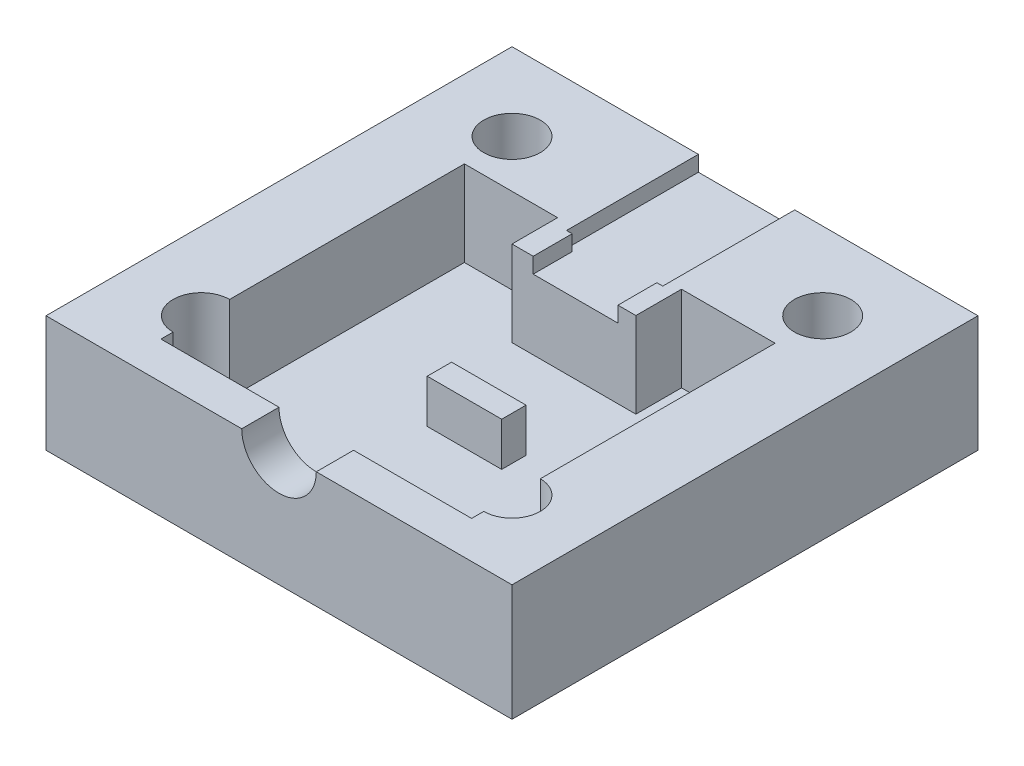
ISO-10303-21;
HEADER;
FILE_DESCRIPTION(('STEP AP214'),'2;1');
FILE_NAME('part.step','',(''),(''),'','','');
FILE_SCHEMA(('AUTOMOTIVE_DESIGN { 1 0 10303 214 1 1 1 1 }'));
ENDSEC;
DATA;
#1=APPLICATION_CONTEXT('core data for automotive mechanical design processes');
#2=APPLICATION_PROTOCOL_DEFINITION('international standard','automotive_design',2000,#1);
#3=PRODUCT_CONTEXT('',#1,'mechanical');
#4=PRODUCT('Part','Part','',(#3));
#5=PRODUCT_RELATED_PRODUCT_CATEGORY('part','',(#4));
#6=PRODUCT_DEFINITION_FORMATION('','',#4);
#7=PRODUCT_DEFINITION_CONTEXT('part definition',#1,'design');
#8=PRODUCT_DEFINITION('design','',#6,#7);
#9=PRODUCT_DEFINITION_SHAPE('','',#8);
#10=(LENGTH_UNIT() NAMED_UNIT(*) SI_UNIT(.MILLI.,.METRE.));
#11=(NAMED_UNIT(*) PLANE_ANGLE_UNIT() SI_UNIT($,.RADIAN.));
#12=(NAMED_UNIT(*) SI_UNIT($,.STERADIAN.) SOLID_ANGLE_UNIT());
#13=UNCERTAINTY_MEASURE_WITH_UNIT(LENGTH_MEASURE(1.E-05),#10,'distance_accuracy_value','');
#14=(GEOMETRIC_REPRESENTATION_CONTEXT(3) GLOBAL_UNCERTAINTY_ASSIGNED_CONTEXT((#13)) GLOBAL_UNIT_ASSIGNED_CONTEXT((#10,
#11,#12)) REPRESENTATION_CONTEXT('',''));
#15=CARTESIAN_POINT('',(0.,0.,0.));
#16=DIRECTION('',(0.,0.,1.));
#17=DIRECTION('',(1.,0.,0.));
#18=AXIS2_PLACEMENT_3D('',#15,#16,#17);
#19=CARTESIAN_POINT('',(0.,2.54,0.));
#20=DIRECTION('',(0.,1.,0.));
#21=DIRECTION('',(0.,0.,1.));
#22=AXIS2_PLACEMENT_3D('',#19,#20,#21);
#23=PLANE('',#22);
#24=CARTESIAN_POINT('',(44.45,2.54,-6.35));
#25=DIRECTION('',(0.,1.,0.));
#26=DIRECTION('',(0.,0.,1.));
#27=AXIS2_PLACEMENT_3D('',#24,#25,#26);
#28=CIRCLE('',#27,2.3114);
#29=CARTESIAN_POINT('',(44.45,2.54,-8.6614));
#30=VERTEX_POINT('',#29);
#31=CARTESIAN_POINT('',(44.45,2.54,-4.0386));
#32=VERTEX_POINT('',#31);
#33=EDGE_CURVE('E46',#30,#32,#28,.T.);
#34=ORIENTED_EDGE('',*,*,#33,.F.);
#35=DIRECTION('',(0.,0.,-1.));
#36=VECTOR('',#35,1.);
#37=CARTESIAN_POINT('',(44.45,2.54,-24.13));
#38=LINE('',#37,#36);
#39=CARTESIAN_POINT('',(44.45,2.54,-27.8594268283473));
#40=VERTEX_POINT('',#39);
#41=EDGE_CURVE('E400',#30,#40,#38,.T.);
#42=ORIENTED_EDGE('',*,*,#41,.T.);
#43=DIRECTION('',(-1.,0.,0.));
#44=VECTOR('',#43,1.);
#45=CARTESIAN_POINT('',(44.45,2.54,-27.8594268283473));
#46=LINE('',#45,#44);
#47=CARTESIAN_POINT('',(36.7988438248262,2.54,-27.8594268283473));
#48=VERTEX_POINT('',#47);
#49=EDGE_CURVE('E291',#40,#48,#46,.T.);
#50=ORIENTED_EDGE('',*,*,#49,.T.);
#51=DIRECTION('',(0.,0.,1.));
#52=VECTOR('',#51,1.);
#53=CARTESIAN_POINT('',(36.7988438248262,2.54,-24.13));
#54=LINE('',#53,#52);
#55=CARTESIAN_POINT('',(36.7988438248262,2.54,-24.13));
#56=VERTEX_POINT('',#55);
#57=EDGE_CURVE('E61',#48,#56,#54,.T.);
#58=ORIENTED_EDGE('',*,*,#57,.T.);
#59=DIRECTION('',(-1.,0.,0.));
#60=VECTOR('',#59,1.);
#61=CARTESIAN_POINT('',(19.05,2.54,-24.13));
#62=LINE('',#61,#60);
#63=CARTESIAN_POINT('',(26.67,2.54,-24.13));
#64=VERTEX_POINT('',#63);
#65=EDGE_CURVE('E404',#56,#64,#62,.T.);
#66=ORIENTED_EDGE('',*,*,#65,.T.);
#67=DIRECTION('',(0.,0.,-1.));
#68=VECTOR('',#67,1.);
#69=CARTESIAN_POINT('',(26.67,2.54,-24.13));
#70=LINE('',#69,#68);
#71=CARTESIAN_POINT('',(26.67,2.54,-27.8594268283473));
#72=VERTEX_POINT('',#71);
#73=EDGE_CURVE('E270',#64,#72,#70,.T.);
#74=ORIENTED_EDGE('',*,*,#73,.T.);
#75=DIRECTION('',(-1.,0.,0.));
#76=VECTOR('',#75,1.);
#77=CARTESIAN_POINT('',(26.67,2.54,-27.8594268283473));
#78=LINE('',#77,#76);
#79=CARTESIAN_POINT('',(19.05,2.54,-27.8594268283473));
#80=VERTEX_POINT('',#79);
#81=EDGE_CURVE('E273',#72,#80,#78,.T.);
#82=ORIENTED_EDGE('',*,*,#81,.T.);
#83=DIRECTION('',(0.,0.,1.));
#84=VECTOR('',#83,1.);
#85=CARTESIAN_POINT('',(19.05,2.54,-24.13));
#86=LINE('',#85,#84);
#87=CARTESIAN_POINT('',(19.05,2.54,-8.6614));
#88=VERTEX_POINT('',#87);
#89=EDGE_CURVE('E393',#80,#88,#86,.T.);
#90=ORIENTED_EDGE('',*,*,#89,.T.);
#91=CARTESIAN_POINT('',(19.05,2.54,-6.35));
#92=DIRECTION('',(0.,1.,0.));
#93=DIRECTION('',(0.,0.,1.));
#94=AXIS2_PLACEMENT_3D('',#91,#92,#93);
#95=CIRCLE('',#94,2.3114);
#96=CARTESIAN_POINT('',(19.05,2.54,-4.0386));
#97=VERTEX_POINT('',#96);
#98=EDGE_CURVE('E461',#97,#88,#95,.T.);
#99=ORIENTED_EDGE('',*,*,#98,.F.);
#100=CARTESIAN_POINT('',(19.05,2.54,-3.048));
#101=VERTEX_POINT('',#100);
#102=EDGE_CURVE('E397',#97,#101,#86,.T.);
#103=ORIENTED_EDGE('',*,*,#102,.T.);
#104=DIRECTION('',(1.,0.,0.));
#105=VECTOR('',#104,1.);
#106=CARTESIAN_POINT('',(19.05,2.54,-3.048));
#107=LINE('',#106,#105);
#108=CARTESIAN_POINT('',(44.45,2.54,-3.048));
#109=VERTEX_POINT('',#108);
#110=EDGE_CURVE('E396',#101,#109,#107,.T.);
#111=ORIENTED_EDGE('',*,*,#110,.T.);
#112=EDGE_CURVE('E401',#109,#32,#38,.T.);
#113=ORIENTED_EDGE('',*,*,#112,.T.);
#114=EDGE_LOOP('',(#34,#42,#50,#58,#66,#74,#82,#90,#99,#103,#111,#113));
#115=FACE_BOUND('',#114,.T.);
#116=DIRECTION('',(1.,0.,0.));
#117=VECTOR('',#116,1.);
#118=CARTESIAN_POINT('',(29.1366001502802,2.54,-14.732));
#119=LINE('',#118,#117);
#120=CARTESIAN_POINT('',(29.1366001502802,2.54,-14.732));
#121=VERTEX_POINT('',#120);
#122=CARTESIAN_POINT('',(35.2249602397373,2.54,-14.732));
#123=VERTEX_POINT('',#122);
#124=EDGE_CURVE('E877',#121,#123,#119,.T.);
#125=ORIENTED_EDGE('',*,*,#124,.F.);
#126=DIRECTION('',(0.,0.,1.));
#127=VECTOR('',#126,1.);
#128=CARTESIAN_POINT('',(29.1366001502802,2.54,-16.7237869469527));
#129=LINE('',#128,#127);
#130=CARTESIAN_POINT('',(29.1366001502802,2.54,-16.7237869469527));
#131=VERTEX_POINT('',#130);
#132=EDGE_CURVE('E260',#131,#121,#129,.T.);
#133=ORIENTED_EDGE('',*,*,#132,.F.);
#134=DIRECTION('',(-1.,0.,0.));
#135=VECTOR('',#134,1.);
#136=CARTESIAN_POINT('',(29.1366001502802,2.54,-16.7237869469527));
#137=LINE('',#136,#135);
#138=CARTESIAN_POINT('',(35.2249602397373,2.54,-16.7237869469527));
#139=VERTEX_POINT('',#138);
#140=EDGE_CURVE('E256',#139,#131,#137,.T.);
#141=ORIENTED_EDGE('',*,*,#140,.F.);
#142=DIRECTION('',(0.,0.,-1.));
#143=VECTOR('',#142,1.);
#144=CARTESIAN_POINT('',(35.2249602397373,2.54,-16.7237869469527));
#145=LINE('',#144,#143);
#146=EDGE_CURVE('E874',#123,#139,#145,.T.);
#147=ORIENTED_EDGE('',*,*,#146,.F.);
#148=EDGE_LOOP('',(#125,#133,#141,#147));
#149=FACE_BOUND('',#148,.T.);
#150=ADVANCED_FACE('F38',(#115,#149),#23,.T.);
#151=CARTESIAN_POINT('',(0.,9.525,0.));
#152=DIRECTION('',(0.,-1.,0.));
#153=DIRECTION('',(0.,0.,-1.));
#154=AXIS2_PLACEMENT_3D('',#151,#152,#153);
#155=PLANE('',#154);
#156=CARTESIAN_POINT('',(44.45,9.525,-31.75));
#157=DIRECTION('',(0.,1.,0.));
#158=DIRECTION('',(0.,0.,1.));
#159=AXIS2_PLACEMENT_3D('',#156,#157,#158);
#160=CIRCLE('',#159,2.3114);
#161=CARTESIAN_POINT('',(44.45,9.525,-29.4386));
#162=VERTEX_POINT('',#161);
#163=EDGE_CURVE('E368',#162,#162,#160,.T.);
#164=ORIENTED_EDGE('',*,*,#163,.F.);
#165=EDGE_LOOP('',(#164));
#166=FACE_BOUND('',#165,.T.);
#167=DIRECTION('',(-1.,0.,0.));
#168=VECTOR('',#167,1.);
#169=CARTESIAN_POINT('',(44.45,9.525,-27.8594268283473));
#170=LINE('',#169,#168);
#171=CARTESIAN_POINT('',(44.45,9.525,-27.8594268283473));
#172=VERTEX_POINT('',#171);
#173=CARTESIAN_POINT('',(36.7988438248262,9.525,-27.8594268283473));
#174=VERTEX_POINT('',#173);
#175=EDGE_CURVE('E262',#172,#174,#170,.T.);
#176=ORIENTED_EDGE('',*,*,#175,.F.);
#177=DIRECTION('',(0.,0.,-1.));
#178=VECTOR('',#177,1.);
#179=CARTESIAN_POINT('',(44.45,9.525,-24.13));
#180=LINE('',#179,#178);
#181=CARTESIAN_POINT('',(44.45,9.525,-8.6614));
#182=VERTEX_POINT('',#181);
#183=EDGE_CURVE('E415',#182,#172,#180,.T.);
#184=ORIENTED_EDGE('',*,*,#183,.F.);
#185=CARTESIAN_POINT('',(44.45,9.525,-6.35));
#186=DIRECTION('',(0.,1.,0.));
#187=DIRECTION('',(0.,0.,1.));
#188=AXIS2_PLACEMENT_3D('',#185,#186,#187);
#189=CIRCLE('',#188,2.3114);
#190=CARTESIAN_POINT('',(44.45,9.525,-4.0386));
#191=VERTEX_POINT('',#190);
#192=EDGE_CURVE('E356',#191,#182,#189,.T.);
#193=ORIENTED_EDGE('',*,*,#192,.F.);
#194=CARTESIAN_POINT('',(44.45,9.525,-3.048));
#195=VERTEX_POINT('',#194);
#196=EDGE_CURVE('E416',#195,#191,#180,.T.);
#197=ORIENTED_EDGE('',*,*,#196,.F.);
#198=DIRECTION('',(1.,0.,0.));
#199=VECTOR('',#198,1.);
#200=CARTESIAN_POINT('',(19.05,9.525,-3.048));
#201=LINE('',#200,#199);
#202=CARTESIAN_POINT('',(34.798,9.525,-3.048));
#203=VERTEX_POINT('',#202);
#204=EDGE_CURVE('E410',#203,#195,#201,.T.);
#205=ORIENTED_EDGE('',*,*,#204,.F.);
#206=DIRECTION('',(0.,0.,1.));
#207=VECTOR('',#206,1.);
#208=CARTESIAN_POINT('',(34.798,9.525,-14.986));
#209=LINE('',#208,#207);
#210=CARTESIAN_POINT('',(34.798,9.525,0.));
#211=VERTEX_POINT('',#210);
#212=EDGE_CURVE('E306',#203,#211,#209,.T.);
#213=ORIENTED_EDGE('',*,*,#212,.T.);
#214=DIRECTION('',(1.,0.,0.));
#215=VECTOR('',#214,1.);
#216=CARTESIAN_POINT('',(12.7,9.525,0.));
#217=LINE('',#216,#215);
#218=CARTESIAN_POINT('',(50.8,9.525,0.));
#219=VERTEX_POINT('',#218);
#220=EDGE_CURVE('E431',#211,#219,#217,.T.);
#221=ORIENTED_EDGE('',*,*,#220,.T.);
#222=DIRECTION('',(0.,0.,-1.));
#223=VECTOR('',#222,1.);
#224=CARTESIAN_POINT('',(50.8,9.525,0.));
#225=LINE('',#224,#223);
#226=CARTESIAN_POINT('',(50.8,9.525,-38.1));
#227=VERTEX_POINT('',#226);
#228=EDGE_CURVE('E436',#219,#227,#225,.T.);
#229=ORIENTED_EDGE('',*,*,#228,.T.);
#230=DIRECTION('',(-1.,0.,0.));
#231=VECTOR('',#230,1.);
#232=CARTESIAN_POINT('',(12.7,9.525,-38.1));
#233=LINE('',#232,#231);
#234=CARTESIAN_POINT('',(35.814,9.525,-38.1));
#235=VERTEX_POINT('',#234);
#236=EDGE_CURVE('E439',#227,#235,#233,.T.);
#237=ORIENTED_EDGE('',*,*,#236,.T.);
#238=DIRECTION('',(0.,0.,-1.));
#239=VECTOR('',#238,1.);
#240=CARTESIAN_POINT('',(35.814,9.525,-38.1));
#241=LINE('',#240,#239);
#242=CARTESIAN_POINT('',(35.814,9.525,-27.313986721033));
#243=VERTEX_POINT('',#242);
#244=EDGE_CURVE('E337',#243,#235,#241,.T.);
#245=ORIENTED_EDGE('',*,*,#244,.F.);
#246=DIRECTION('',(1.,0.,0.));
#247=VECTOR('',#246,1.);
#248=CARTESIAN_POINT('',(27.94,9.525,-27.313986721033));
#249=LINE('',#248,#247);
#250=CARTESIAN_POINT('',(35.332205776193,9.525,-27.313986721033));
#251=VERTEX_POINT('',#250);
#252=EDGE_CURVE('E349',#251,#243,#249,.T.);
#253=ORIENTED_EDGE('',*,*,#252,.F.);
#254=DIRECTION('',(0.,0.,-1.));
#255=VECTOR('',#254,1.);
#256=CARTESIAN_POINT('',(35.332205776193,9.525,-27.313986721033));
#257=LINE('',#256,#255);
#258=CARTESIAN_POINT('',(35.332205776193,9.525,-24.13));
#259=VERTEX_POINT('',#258);
#260=EDGE_CURVE('E314',#259,#251,#257,.T.);
#261=ORIENTED_EDGE('',*,*,#260,.F.);
#262=DIRECTION('',(-1.,0.,0.));
#263=VECTOR('',#262,1.);
#264=CARTESIAN_POINT('',(19.05,9.525,-24.13));
#265=LINE('',#264,#263);
#266=CARTESIAN_POINT('',(36.7988438248262,9.525,-24.13));
#267=VERTEX_POINT('',#266);
#268=EDGE_CURVE('E420',#267,#259,#265,.T.);
#269=ORIENTED_EDGE('',*,*,#268,.F.);
#270=DIRECTION('',(0.,0.,1.));
#271=VECTOR('',#270,1.);
#272=CARTESIAN_POINT('',(36.7988438248262,9.525,-24.13));
#273=LINE('',#272,#271);
#274=EDGE_CURVE('E265',#174,#267,#273,.T.);
#275=ORIENTED_EDGE('',*,*,#274,.F.);
#276=EDGE_LOOP('',(#176,#184,#193,#197,#205,#213,#221,#229,#237,#245,#253,#261,#269,#275));
#277=FACE_BOUND('',#276,.T.);
#278=ADVANCED_FACE('F492',(#166,#277),#155,.F.);
#279=CARTESIAN_POINT('',(27.94,8.255,-27.313986721033));
#280=DIRECTION('',(0.,0.,1.));
#281=DIRECTION('',(1.,0.,0.));
#282=AXIS2_PLACEMENT_3D('',#279,#280,#281);
#283=PLANE('',#282);
#284=CARTESIAN_POINT('',(27.94,9.525,-27.313986721033));
#285=VERTEX_POINT('',#284);
#286=CARTESIAN_POINT('',(28.4029054366233,9.525,-27.313986721033));
#287=VERTEX_POINT('',#286);
#288=EDGE_CURVE('E350',#285,#287,#249,.T.);
#289=ORIENTED_EDGE('',*,*,#288,.T.);
#290=DIRECTION('',(0.,1.,0.));
#291=VECTOR('',#290,1.);
#292=CARTESIAN_POINT('',(28.4029054366233,8.255,-27.313986721033));
#293=LINE('',#292,#291);
#294=CARTESIAN_POINT('',(28.4029054366233,8.255,-27.313986721033));
#295=VERTEX_POINT('',#294);
#296=EDGE_CURVE('E322',#295,#287,#293,.T.);
#297=ORIENTED_EDGE('',*,*,#296,.F.);
#298=DIRECTION('',(1.,0.,0.));
#299=VECTOR('',#298,1.);
#300=CARTESIAN_POINT('',(27.94,8.255,-27.313986721033));
#301=LINE('',#300,#299);
#302=CARTESIAN_POINT('',(27.94,8.255,-27.313986721033));
#303=VERTEX_POINT('',#302);
#304=EDGE_CURVE('E338',#303,#295,#301,.T.);
#305=ORIENTED_EDGE('',*,*,#304,.F.);
#306=DIRECTION('',(0.,1.,0.));
#307=VECTOR('',#306,1.);
#308=CARTESIAN_POINT('',(27.94,8.255,-27.313986721033));
#309=LINE('',#308,#307);
#310=EDGE_CURVE('E347',#303,#285,#309,.T.);
#311=ORIENTED_EDGE('',*,*,#310,.T.);
#312=EDGE_LOOP('',(#289,#297,#305,#311));
#313=FACE_BOUND('',#312,.T.);
#314=ADVANCED_FACE('F535',(#313),#283,.F.);
#315=CARTESIAN_POINT('',(19.05,2.54,-24.13));
#316=DIRECTION('',(-1.,0.,0.));
#317=DIRECTION('',(0.,0.,1.));
#318=AXIS2_PLACEMENT_3D('',#315,#316,#317);
#319=PLANE('',#318);
#320=ORIENTED_EDGE('',*,*,#102,.F.);
#321=DIRECTION('',(0.,1.,0.));
#322=VECTOR('',#321,1.);
#323=CARTESIAN_POINT('',(19.05,-24.892,-4.0386));
#324=LINE('',#323,#322);
#325=CARTESIAN_POINT('',(19.05,9.525,-4.0386));
#326=VERTEX_POINT('',#325);
#327=EDGE_CURVE('E377',#97,#326,#324,.T.);
#328=ORIENTED_EDGE('',*,*,#327,.T.);
#329=DIRECTION('',(0.,0.,1.));
#330=VECTOR('',#329,1.);
#331=CARTESIAN_POINT('',(19.05,9.525,-24.13));
#332=LINE('',#331,#330);
#333=CARTESIAN_POINT('',(19.05,9.525,-3.048));
#334=VERTEX_POINT('',#333);
#335=EDGE_CURVE('E411',#326,#334,#332,.T.);
#336=ORIENTED_EDGE('',*,*,#335,.T.);
#337=DIRECTION('',(0.,1.,0.));
#338=VECTOR('',#337,1.);
#339=CARTESIAN_POINT('',(19.05,2.54,-3.048));
#340=LINE('',#339,#338);
#341=EDGE_CURVE('E406',#101,#334,#340,.T.);
#342=ORIENTED_EDGE('',*,*,#341,.F.);
#343=EDGE_LOOP('',(#320,#328,#336,#342));
#344=FACE_BOUND('',#343,.T.);
#345=ADVANCED_FACE('F473',(#344),#319,.F.);
#346=CARTESIAN_POINT('',(44.45,2.54,-24.13));
#347=DIRECTION('',(1.,0.,0.));
#348=DIRECTION('',(0.,0.,-1.));
#349=AXIS2_PLACEMENT_3D('',#346,#347,#348);
#350=PLANE('',#349);
#351=ORIENTED_EDGE('',*,*,#41,.F.);
#352=DIRECTION('',(0.,1.,0.));
#353=VECTOR('',#352,1.);
#354=CARTESIAN_POINT('',(44.45,-24.892,-8.6614));
#355=LINE('',#354,#353);
#356=EDGE_CURVE('E386',#30,#182,#355,.T.);
#357=ORIENTED_EDGE('',*,*,#356,.T.);
#358=ORIENTED_EDGE('',*,*,#183,.T.);
#359=DIRECTION('',(0.,1.,0.));
#360=VECTOR('',#359,1.);
#361=CARTESIAN_POINT('',(44.45,2.54,-27.8594268283473));
#362=LINE('',#361,#360);
#363=EDGE_CURVE('E293',#40,#172,#362,.T.);
#364=ORIENTED_EDGE('',*,*,#363,.F.);
#365=EDGE_LOOP('',(#351,#357,#358,#364));
#366=FACE_BOUND('',#365,.T.);
#367=ADVANCED_FACE('F506',(#366),#350,.F.);
#368=CARTESIAN_POINT('',(12.7,9.525,0.));
#369=DIRECTION('',(1.,0.,0.));
#370=DIRECTION('',(0.,0.,-1.));
#371=AXIS2_PLACEMENT_3D('',#368,#369,#370);
#372=PLANE('',#371);
#373=DIRECTION('',(0.,0.,1.));
#374=VECTOR('',#373,1.);
#375=CARTESIAN_POINT('',(12.7,0.,0.));
#376=LINE('',#375,#374);
#377=CARTESIAN_POINT('',(12.7,0.,-38.1));
#378=VERTEX_POINT('',#377);
#379=CARTESIAN_POINT('',(12.7,0.,0.));
#380=VERTEX_POINT('',#379);
#381=EDGE_CURVE('E425',#378,#380,#376,.T.);
#382=ORIENTED_EDGE('',*,*,#381,.T.);
#383=DIRECTION('',(0.,-1.,0.));
#384=VECTOR('',#383,1.);
#385=CARTESIAN_POINT('',(12.7,9.525,0.));
#386=LINE('',#385,#384);
#387=CARTESIAN_POINT('',(12.7,9.525,0.));
#388=VERTEX_POINT('',#387);
#389=EDGE_CURVE('E458',#388,#380,#386,.T.);
#390=ORIENTED_EDGE('',*,*,#389,.F.);
#391=DIRECTION('',(0.,0.,1.));
#392=VECTOR('',#391,1.);
#393=CARTESIAN_POINT('',(12.7,9.525,0.));
#394=LINE('',#393,#392);
#395=CARTESIAN_POINT('',(12.7,9.525,-38.1));
#396=VERTEX_POINT('',#395);
#397=EDGE_CURVE('E428',#396,#388,#394,.T.);
#398=ORIENTED_EDGE('',*,*,#397,.F.);
#399=DIRECTION('',(0.,-1.,0.));
#400=VECTOR('',#399,1.);
#401=CARTESIAN_POINT('',(12.7,9.525,-38.1));
#402=LINE('',#401,#400);
#403=EDGE_CURVE('E442',#396,#378,#402,.T.);
#404=ORIENTED_EDGE('',*,*,#403,.T.);
#405=EDGE_LOOP('',(#382,#390,#398,#404));
#406=FACE_BOUND('',#405,.T.);
#407=ADVANCED_FACE('F40',(#406),#372,.F.);
#408=CARTESIAN_POINT('',(12.7,9.525,0.));
#409=DIRECTION('',(0.,0.,-1.));
#410=DIRECTION('',(-1.,0.,0.));
#411=AXIS2_PLACEMENT_3D('',#408,#409,#410);
#412=PLANE('',#411);
#413=ORIENTED_EDGE('',*,*,#220,.F.);
#414=CARTESIAN_POINT('',(31.75,9.525,0.));
#415=DIRECTION('',(0.,0.,1.));
#416=DIRECTION('',(1.,0.,0.));
#417=AXIS2_PLACEMENT_3D('',#414,#415,#416);
#418=CIRCLE('',#417,3.048);
#419=CARTESIAN_POINT('',(28.702,9.525,0.));
#420=VERTEX_POINT('',#419);
#421=EDGE_CURVE('E286',#420,#211,#418,.T.);
#422=ORIENTED_EDGE('',*,*,#421,.F.);
#423=EDGE_CURVE('E433',#388,#420,#217,.T.);
#424=ORIENTED_EDGE('',*,*,#423,.F.);
#425=ORIENTED_EDGE('',*,*,#389,.T.);
#426=DIRECTION('',(1.,0.,0.));
#427=VECTOR('',#426,1.);
#428=CARTESIAN_POINT('',(12.7,0.,0.));
#429=LINE('',#428,#427);
#430=CARTESIAN_POINT('',(50.8,0.,0.));
#431=VERTEX_POINT('',#430);
#432=EDGE_CURVE('E445',#380,#431,#429,.T.);
#433=ORIENTED_EDGE('',*,*,#432,.T.);
#434=DIRECTION('',(0.,-1.,0.));
#435=VECTOR('',#434,1.);
#436=CARTESIAN_POINT('',(50.8,9.525,0.));
#437=LINE('',#436,#435);
#438=EDGE_CURVE('E455',#219,#431,#437,.T.);
#439=ORIENTED_EDGE('',*,*,#438,.F.);
#440=EDGE_LOOP('',(#413,#422,#424,#425,#433,#439));
#441=FACE_BOUND('',#440,.T.);
#442=ADVANCED_FACE('F487',(#441),#412,.F.);
#443=CARTESIAN_POINT('',(50.8,9.525,0.));
#444=DIRECTION('',(-1.,0.,0.));
#445=DIRECTION('',(0.,0.,1.));
#446=AXIS2_PLACEMENT_3D('',#443,#444,#445);
#447=PLANE('',#446);
#448=DIRECTION('',(0.,0.,-1.));
#449=VECTOR('',#448,1.);
#450=CARTESIAN_POINT('',(50.8,0.,0.));
#451=LINE('',#450,#449);
#452=CARTESIAN_POINT('',(50.8,0.,-38.1));
#453=VERTEX_POINT('',#452);
#454=EDGE_CURVE('E447',#431,#453,#451,.T.);
#455=ORIENTED_EDGE('',*,*,#454,.T.);
#456=DIRECTION('',(0.,-1.,0.));
#457=VECTOR('',#456,1.);
#458=CARTESIAN_POINT('',(50.8,9.525,-38.1));
#459=LINE('',#458,#457);
#460=EDGE_CURVE('E452',#227,#453,#459,.T.);
#461=ORIENTED_EDGE('',*,*,#460,.F.);
#462=ORIENTED_EDGE('',*,*,#228,.F.);
#463=ORIENTED_EDGE('',*,*,#438,.T.);
#464=EDGE_LOOP('',(#455,#461,#462,#463));
#465=FACE_BOUND('',#464,.T.);
#466=ADVANCED_FACE('F553',(#465),#447,.F.);
#467=CARTESIAN_POINT('',(12.7,9.525,-38.1));
#468=DIRECTION('',(0.,0.,1.));
#469=DIRECTION('',(1.,0.,0.));
#470=AXIS2_PLACEMENT_3D('',#467,#468,#469);
#471=PLANE('',#470);
#472=CARTESIAN_POINT('',(27.94,9.525,-38.1));
#473=VERTEX_POINT('',#472);
#474=EDGE_CURVE('E438',#473,#396,#233,.T.);
#475=ORIENTED_EDGE('',*,*,#474,.F.);
#476=DIRECTION('',(0.,1.,0.));
#477=VECTOR('',#476,1.);
#478=CARTESIAN_POINT('',(27.94,8.255,-38.1));
#479=LINE('',#478,#477);
#480=CARTESIAN_POINT('',(27.94,8.255,-38.1));
#481=VERTEX_POINT('',#480);
#482=EDGE_CURVE('E354',#481,#473,#479,.T.);
#483=ORIENTED_EDGE('',*,*,#482,.F.);
#484=DIRECTION('',(-1.,0.,0.));
#485=VECTOR('',#484,1.);
#486=CARTESIAN_POINT('',(27.94,8.255,-38.1));
#487=LINE('',#486,#485);
#488=CARTESIAN_POINT('',(35.814,8.255,-38.1));
#489=VERTEX_POINT('',#488);
#490=EDGE_CURVE('E344',#489,#481,#487,.T.);
#491=ORIENTED_EDGE('',*,*,#490,.F.);
#492=DIRECTION('',(0.,1.,0.));
#493=VECTOR('',#492,1.);
#494=CARTESIAN_POINT('',(35.814,8.255,-38.1));
#495=LINE('',#494,#493);
#496=EDGE_CURVE('E357',#489,#235,#495,.T.);
#497=ORIENTED_EDGE('',*,*,#496,.T.);
#498=ORIENTED_EDGE('',*,*,#236,.F.);
#499=ORIENTED_EDGE('',*,*,#460,.T.);
#500=DIRECTION('',(-1.,0.,0.));
#501=VECTOR('',#500,1.);
#502=CARTESIAN_POINT('',(12.7,0.,-38.1));
#503=LINE('',#502,#501);
#504=EDGE_CURVE('E432',#453,#378,#503,.T.);
#505=ORIENTED_EDGE('',*,*,#504,.T.);
#506=ORIENTED_EDGE('',*,*,#403,.F.);
#507=EDGE_LOOP('',(#475,#483,#491,#497,#498,#499,#505,#506));
#508=FACE_BOUND('',#507,.T.);
#509=ADVANCED_FACE('F543',(#508),#471,.F.);
#510=CARTESIAN_POINT('',(19.05,9.525,-31.75));
#511=DIRECTION('',(0.,1.,0.));
#512=DIRECTION('',(0.,0.,1.));
#513=AXIS2_PLACEMENT_3D('',#510,#511,#512);
#514=CIRCLE('',#513,2.3114);
#515=CARTESIAN_POINT('',(19.05,9.525,-29.4386));
#516=VERTEX_POINT('',#515);
#517=EDGE_CURVE('E365',#516,#516,#514,.T.);
#518=ORIENTED_EDGE('',*,*,#517,.F.);
#519=EDGE_LOOP('',(#518));
#520=FACE_BOUND('',#519,.T.);
#521=DIRECTION('',(-1.,0.,0.));
#522=VECTOR('',#521,1.);
#523=CARTESIAN_POINT('',(26.67,9.525,-27.8594268283473));
#524=LINE('',#523,#522);
#525=CARTESIAN_POINT('',(26.67,9.525,-27.8594268283473));
#526=VERTEX_POINT('',#525);
#527=CARTESIAN_POINT('',(19.05,9.525,-27.8594268283473));
#528=VERTEX_POINT('',#527);
#529=EDGE_CURVE('E274',#526,#528,#524,.T.);
#530=ORIENTED_EDGE('',*,*,#529,.F.);
#531=DIRECTION('',(0.,0.,-1.));
#532=VECTOR('',#531,1.);
#533=CARTESIAN_POINT('',(26.67,9.525,-24.13));
#534=LINE('',#533,#532);
#535=CARTESIAN_POINT('',(26.67,9.525,-24.13));
#536=VERTEX_POINT('',#535);
#537=EDGE_CURVE('E278',#536,#526,#534,.T.);
#538=ORIENTED_EDGE('',*,*,#537,.F.);
#539=CARTESIAN_POINT('',(28.4029054366233,9.525,-24.13));
#540=VERTEX_POINT('',#539);
#541=EDGE_CURVE('E419',#540,#536,#265,.T.);
#542=ORIENTED_EDGE('',*,*,#541,.F.);
#543=DIRECTION('',(0.,0.,1.));
#544=VECTOR('',#543,1.);
#545=CARTESIAN_POINT('',(28.4029054366233,9.525,-27.313986721033));
#546=LINE('',#545,#544);
#547=EDGE_CURVE('E309',#287,#540,#546,.T.);
#548=ORIENTED_EDGE('',*,*,#547,.F.);
#549=ORIENTED_EDGE('',*,*,#288,.F.);
#550=DIRECTION('',(0.,0.,1.));
#551=VECTOR('',#550,1.);
#552=CARTESIAN_POINT('',(27.94,9.525,-38.1));
#553=LINE('',#552,#551);
#554=EDGE_CURVE('E324',#473,#285,#553,.T.);
#555=ORIENTED_EDGE('',*,*,#554,.F.);
#556=ORIENTED_EDGE('',*,*,#474,.T.);
#557=ORIENTED_EDGE('',*,*,#397,.T.);
#558=ORIENTED_EDGE('',*,*,#423,.T.);
#559=DIRECTION('',(0.,0.,1.));
#560=VECTOR('',#559,1.);
#561=CARTESIAN_POINT('',(28.702,9.525,-14.986));
#562=LINE('',#561,#560);
#563=CARTESIAN_POINT('',(28.702,9.525,-3.048));
#564=VERTEX_POINT('',#563);
#565=EDGE_CURVE('E303',#420,#564,#562,.F.);
#566=ORIENTED_EDGE('',*,*,#565,.T.);
#567=EDGE_CURVE('E412',#334,#564,#201,.T.);
#568=ORIENTED_EDGE('',*,*,#567,.F.);
#569=ORIENTED_EDGE('',*,*,#335,.F.);
#570=CARTESIAN_POINT('',(19.05,9.525,-6.35));
#571=DIRECTION('',(0.,1.,0.));
#572=DIRECTION('',(0.,0.,1.));
#573=AXIS2_PLACEMENT_3D('',#570,#571,#572);
#574=CIRCLE('',#573,2.3114);
#575=CARTESIAN_POINT('',(19.05,9.525,-8.6614));
#576=VERTEX_POINT('',#575);
#577=EDGE_CURVE('E369',#576,#326,#574,.T.);
#578=ORIENTED_EDGE('',*,*,#577,.F.);
#579=EDGE_CURVE('E407',#528,#576,#332,.T.);
#580=ORIENTED_EDGE('',*,*,#579,.F.);
#581=EDGE_LOOP('',(#530,#538,#542,#548,#549,#555,#556,#557,#558,#566,#568,#569,#578,#580));
#582=FACE_BOUND('',#581,.T.);
#583=ADVANCED_FACE('F481',(#520,#582),#155,.F.);
#584=CARTESIAN_POINT('',(0.,0.,0.));
#585=DIRECTION('',(0.,-1.,0.));
#586=DIRECTION('',(0.,0.,-1.));
#587=AXIS2_PLACEMENT_3D('',#584,#585,#586);
#588=PLANE('',#587);
#589=CARTESIAN_POINT('',(44.45,0.,-6.35));
#590=DIRECTION('',(0.,-1.,0.));
#591=DIRECTION('',(0.,0.,-1.));
#592=AXIS2_PLACEMENT_3D('',#589,#590,#591);
#593=CIRCLE('',#592,2.3114);
#594=CARTESIAN_POINT('',(44.45,0.,-8.6614));
#595=VERTEX_POINT('',#594);
#596=EDGE_CURVE('E389',#595,#595,#593,.T.);
#597=ORIENTED_EDGE('',*,*,#596,.F.);
#598=EDGE_LOOP('',(#597));
#599=FACE_BOUND('',#598,.T.);
#600=CARTESIAN_POINT('',(19.05,0.,-6.35));
#601=DIRECTION('',(0.,-1.,0.));
#602=DIRECTION('',(0.,0.,-1.));
#603=AXIS2_PLACEMENT_3D('',#600,#601,#602);
#604=CIRCLE('',#603,2.3114);
#605=CARTESIAN_POINT('',(19.05,0.,-8.6614));
#606=VERTEX_POINT('',#605);
#607=EDGE_CURVE('E380',#606,#606,#604,.T.);
#608=ORIENTED_EDGE('',*,*,#607,.F.);
#609=EDGE_LOOP('',(#608));
#610=FACE_BOUND('',#609,.T.);
#611=CARTESIAN_POINT('',(19.05,0.,-31.75));
#612=DIRECTION('',(0.,-1.,0.));
#613=DIRECTION('',(0.,0.,-1.));
#614=AXIS2_PLACEMENT_3D('',#611,#612,#613);
#615=CIRCLE('',#614,2.3114);
#616=CARTESIAN_POINT('',(19.05,0.,-34.0614));
#617=VERTEX_POINT('',#616);
#618=EDGE_CURVE('E465',#617,#617,#615,.T.);
#619=ORIENTED_EDGE('',*,*,#618,.F.);
#620=EDGE_LOOP('',(#619));
#621=FACE_BOUND('',#620,.T.);
#622=CARTESIAN_POINT('',(44.45,0.,-31.75));
#623=DIRECTION('',(0.,-1.,0.));
#624=DIRECTION('',(0.,0.,-1.));
#625=AXIS2_PLACEMENT_3D('',#622,#623,#624);
#626=CIRCLE('',#625,2.3114);
#627=CARTESIAN_POINT('',(44.45,0.,-34.0614));
#628=VERTEX_POINT('',#627);
#629=EDGE_CURVE('E392',#628,#628,#626,.T.);
#630=ORIENTED_EDGE('',*,*,#629,.F.);
#631=EDGE_LOOP('',(#630));
#632=FACE_BOUND('',#631,.T.);
#633=ORIENTED_EDGE('',*,*,#381,.F.);
#634=ORIENTED_EDGE('',*,*,#504,.F.);
#635=ORIENTED_EDGE('',*,*,#454,.F.);
#636=ORIENTED_EDGE('',*,*,#432,.F.);
#637=EDGE_LOOP('',(#633,#634,#635,#636));
#638=FACE_BOUND('',#637,.T.);
#639=ADVANCED_FACE('F554',(#599,#610,#621,#632,#638),#588,.T.);
#640=ORIENTED_EDGE('',*,*,#579,.T.);
#641=DIRECTION('',(0.,1.,0.));
#642=VECTOR('',#641,1.);
#643=CARTESIAN_POINT('',(19.05,-24.892,-8.6614));
#644=LINE('',#643,#642);
#645=EDGE_CURVE('E374',#576,#88,#644,.F.);
#646=ORIENTED_EDGE('',*,*,#645,.T.);
#647=ORIENTED_EDGE('',*,*,#89,.F.);
#648=DIRECTION('',(0.,1.,0.));
#649=VECTOR('',#648,1.);
#650=CARTESIAN_POINT('',(19.05,2.54,-27.8594268283473));
#651=LINE('',#650,#649);
#652=EDGE_CURVE('E287',#80,#528,#651,.T.);
#653=ORIENTED_EDGE('',*,*,#652,.T.);
#654=EDGE_LOOP('',(#640,#646,#647,#653));
#655=FACE_BOUND('',#654,.T.);
#656=ADVANCED_FACE('F514',(#655),#319,.F.);
#657=CARTESIAN_POINT('',(19.05,2.54,-24.13));
#658=DIRECTION('',(0.,0.,-1.));
#659=DIRECTION('',(-1.,0.,0.));
#660=AXIS2_PLACEMENT_3D('',#657,#658,#659);
#661=PLANE('',#660);
#662=ORIENTED_EDGE('',*,*,#541,.T.);
#663=DIRECTION('',(0.,1.,0.));
#664=VECTOR('',#663,1.);
#665=CARTESIAN_POINT('',(26.67,2.54,-24.13));
#666=LINE('',#665,#664);
#667=EDGE_CURVE('E284',#64,#536,#666,.T.);
#668=ORIENTED_EDGE('',*,*,#667,.F.);
#669=ORIENTED_EDGE('',*,*,#65,.F.);
#670=DIRECTION('',(0.,1.,0.));
#671=VECTOR('',#670,1.);
#672=CARTESIAN_POINT('',(36.7988438248262,2.54,-24.13));
#673=LINE('',#672,#671);
#674=EDGE_CURVE('E281',#56,#267,#673,.T.);
#675=ORIENTED_EDGE('',*,*,#674,.T.);
#676=ORIENTED_EDGE('',*,*,#268,.T.);
#677=DIRECTION('',(0.,1.,0.));
#678=VECTOR('',#677,1.);
#679=CARTESIAN_POINT('',(35.332205776193,8.255,-24.13));
#680=LINE('',#679,#678);
#681=CARTESIAN_POINT('',(35.332205776193,8.255,-24.13));
#682=VERTEX_POINT('',#681);
#683=EDGE_CURVE('E328',#682,#259,#680,.T.);
#684=ORIENTED_EDGE('',*,*,#683,.F.);
#685=DIRECTION('',(1.,0.,0.));
#686=VECTOR('',#685,1.);
#687=CARTESIAN_POINT('',(28.4029054366233,8.255,-24.13));
#688=LINE('',#687,#686);
#689=CARTESIAN_POINT('',(28.4029054366233,8.255,-24.13));
#690=VERTEX_POINT('',#689);
#691=EDGE_CURVE('E313',#690,#682,#688,.T.);
#692=ORIENTED_EDGE('',*,*,#691,.F.);
#693=DIRECTION('',(0.,1.,0.));
#694=VECTOR('',#693,1.);
#695=CARTESIAN_POINT('',(28.4029054366233,8.255,-24.13));
#696=LINE('',#695,#694);
#697=EDGE_CURVE('E319',#690,#540,#696,.T.);
#698=ORIENTED_EDGE('',*,*,#697,.T.);
#699=EDGE_LOOP('',(#662,#668,#669,#675,#676,#684,#692,#698));
#700=FACE_BOUND('',#699,.T.);
#701=ADVANCED_FACE('F527',(#700),#661,.F.);
#702=ORIENTED_EDGE('',*,*,#196,.T.);
#703=DIRECTION('',(0.,1.,0.));
#704=VECTOR('',#703,1.);
#705=CARTESIAN_POINT('',(44.45,-24.892,-4.0386));
#706=LINE('',#705,#704);
#707=EDGE_CURVE('E383',#191,#32,#706,.F.);
#708=ORIENTED_EDGE('',*,*,#707,.T.);
#709=ORIENTED_EDGE('',*,*,#112,.F.);
#710=DIRECTION('',(0.,1.,0.));
#711=VECTOR('',#710,1.);
#712=CARTESIAN_POINT('',(44.45,2.54,-3.048));
#713=LINE('',#712,#711);
#714=EDGE_CURVE('E422',#109,#195,#713,.T.);
#715=ORIENTED_EDGE('',*,*,#714,.T.);
#716=EDGE_LOOP('',(#702,#708,#709,#715));
#717=FACE_BOUND('',#716,.T.);
#718=ADVANCED_FACE('F498',(#717),#350,.F.);
#719=CARTESIAN_POINT('',(19.05,2.54,-3.048));
#720=DIRECTION('',(0.,0.,1.));
#721=DIRECTION('',(1.,0.,0.));
#722=AXIS2_PLACEMENT_3D('',#719,#720,#721);
#723=PLANE('',#722);
#724=ORIENTED_EDGE('',*,*,#567,.T.);
#725=CARTESIAN_POINT('',(31.75,9.525,-3.048));
#726=DIRECTION('',(0.,0.,1.));
#727=DIRECTION('',(1.,0.,0.));
#728=AXIS2_PLACEMENT_3D('',#725,#726,#727);
#729=CIRCLE('',#728,3.048);
#730=EDGE_CURVE('E11',#564,#203,#729,.T.);
#731=ORIENTED_EDGE('',*,*,#730,.T.);
#732=ORIENTED_EDGE('',*,*,#204,.T.);
#733=ORIENTED_EDGE('',*,*,#714,.F.);
#734=ORIENTED_EDGE('',*,*,#110,.F.);
#735=ORIENTED_EDGE('',*,*,#341,.T.);
#736=EDGE_LOOP('',(#724,#731,#732,#733,#734,#735));
#737=FACE_BOUND('',#736,.T.);
#738=ADVANCED_FACE('F479',(#737),#723,.F.);
#739=CARTESIAN_POINT('',(19.05,-24.892,-6.35));
#740=DIRECTION('',(0.,1.,0.));
#741=DIRECTION('',(0.,0.,1.));
#742=AXIS2_PLACEMENT_3D('',#739,#740,#741);
#743=CYLINDRICAL_SURFACE('',#742,2.3114);
#744=ORIENTED_EDGE('',*,*,#607,.T.);
#745=EDGE_LOOP('',(#744));
#746=FACE_BOUND('',#745,.T.);
#747=ORIENTED_EDGE('',*,*,#98,.T.);
#748=ORIENTED_EDGE('',*,*,#645,.F.);
#749=ORIENTED_EDGE('',*,*,#577,.T.);
#750=ORIENTED_EDGE('',*,*,#327,.F.);
#751=EDGE_LOOP('',(#747,#748,#749,#750));
#752=FACE_BOUND('',#751,.T.);
#753=ADVANCED_FACE('F512',(#746,#752),#743,.F.);
#754=CARTESIAN_POINT('',(44.45,-24.892,-6.35));
#755=DIRECTION('',(0.,1.,0.));
#756=DIRECTION('',(0.,0.,1.));
#757=AXIS2_PLACEMENT_3D('',#754,#755,#756);
#758=CYLINDRICAL_SURFACE('',#757,2.3114);
#759=ORIENTED_EDGE('',*,*,#596,.T.);
#760=EDGE_LOOP('',(#759));
#761=FACE_BOUND('',#760,.T.);
#762=ORIENTED_EDGE('',*,*,#33,.T.);
#763=ORIENTED_EDGE('',*,*,#707,.F.);
#764=ORIENTED_EDGE('',*,*,#192,.T.);
#765=ORIENTED_EDGE('',*,*,#356,.F.);
#766=EDGE_LOOP('',(#762,#763,#764,#765));
#767=FACE_BOUND('',#766,.T.);
#768=ADVANCED_FACE('F502',(#761,#767),#758,.F.);
#769=CARTESIAN_POINT('',(44.45,-24.892,-31.75));
#770=DIRECTION('',(0.,1.,0.));
#771=DIRECTION('',(0.,0.,1.));
#772=AXIS2_PLACEMENT_3D('',#769,#770,#771);
#773=CYLINDRICAL_SURFACE('',#772,2.3114);
#774=ORIENTED_EDGE('',*,*,#629,.T.);
#775=EDGE_LOOP('',(#774));
#776=FACE_BOUND('',#775,.T.);
#777=ORIENTED_EDGE('',*,*,#163,.T.);
#778=EDGE_LOOP('',(#777));
#779=FACE_BOUND('',#778,.T.);
#780=ADVANCED_FACE('F576',(#776,#779),#773,.F.);
#781=CARTESIAN_POINT('',(19.05,-24.892,-31.75));
#782=DIRECTION('',(0.,1.,0.));
#783=DIRECTION('',(0.,0.,1.));
#784=AXIS2_PLACEMENT_3D('',#781,#782,#783);
#785=CYLINDRICAL_SURFACE('',#784,2.3114);
#786=ORIENTED_EDGE('',*,*,#618,.T.);
#787=EDGE_LOOP('',(#786));
#788=FACE_BOUND('',#787,.T.);
#789=ORIENTED_EDGE('',*,*,#517,.T.);
#790=EDGE_LOOP('',(#789));
#791=FACE_BOUND('',#790,.T.);
#792=ADVANCED_FACE('F593',(#788,#791),#785,.F.);
#793=CARTESIAN_POINT('',(27.94,8.255,-38.1));
#794=DIRECTION('',(-1.,0.,0.));
#795=DIRECTION('',(0.,0.,1.));
#796=AXIS2_PLACEMENT_3D('',#793,#794,#795);
#797=PLANE('',#796);
#798=ORIENTED_EDGE('',*,*,#554,.T.);
#799=ORIENTED_EDGE('',*,*,#310,.F.);
#800=DIRECTION('',(0.,0.,1.));
#801=VECTOR('',#800,1.);
#802=CARTESIAN_POINT('',(27.94,8.255,-38.1));
#803=LINE('',#802,#801);
#804=EDGE_CURVE('E333',#481,#303,#803,.T.);
#805=ORIENTED_EDGE('',*,*,#804,.F.);
#806=ORIENTED_EDGE('',*,*,#482,.T.);
#807=EDGE_LOOP('',(#798,#799,#805,#806));
#808=FACE_BOUND('',#807,.T.);
#809=ADVANCED_FACE('F538',(#808),#797,.F.);
#810=CARTESIAN_POINT('',(35.814,8.255,-38.1));
#811=DIRECTION('',(1.,0.,0.));
#812=DIRECTION('',(0.,0.,-1.));
#813=AXIS2_PLACEMENT_3D('',#810,#811,#812);
#814=PLANE('',#813);
#815=ORIENTED_EDGE('',*,*,#244,.T.);
#816=ORIENTED_EDGE('',*,*,#496,.F.);
#817=DIRECTION('',(0.,0.,-1.));
#818=VECTOR('',#817,1.);
#819=CARTESIAN_POINT('',(35.814,8.255,-38.1));
#820=LINE('',#819,#818);
#821=CARTESIAN_POINT('',(35.814,8.255,-27.313986721033));
#822=VERTEX_POINT('',#821);
#823=EDGE_CURVE('E341',#822,#489,#820,.T.);
#824=ORIENTED_EDGE('',*,*,#823,.F.);
#825=DIRECTION('',(0.,1.,0.));
#826=VECTOR('',#825,1.);
#827=CARTESIAN_POINT('',(35.814,8.255,-27.313986721033));
#828=LINE('',#827,#826);
#829=EDGE_CURVE('E360',#822,#243,#828,.T.);
#830=ORIENTED_EDGE('',*,*,#829,.T.);
#831=EDGE_LOOP('',(#815,#816,#824,#830));
#832=FACE_BOUND('',#831,.T.);
#833=ADVANCED_FACE('F598',(#832),#814,.F.);
#834=CARTESIAN_POINT('',(35.332205776193,8.255,-27.313986721033));
#835=VERTEX_POINT('',#834);
#836=EDGE_CURVE('E336',#835,#822,#301,.T.);
#837=ORIENTED_EDGE('',*,*,#836,.F.);
#838=DIRECTION('',(0.,1.,0.));
#839=VECTOR('',#838,1.);
#840=CARTESIAN_POINT('',(35.332205776193,8.255,-27.313986721033));
#841=LINE('',#840,#839);
#842=EDGE_CURVE('E325',#835,#251,#841,.T.);
#843=ORIENTED_EDGE('',*,*,#842,.T.);
#844=ORIENTED_EDGE('',*,*,#252,.T.);
#845=ORIENTED_EDGE('',*,*,#829,.F.);
#846=EDGE_LOOP('',(#837,#843,#844,#845));
#847=FACE_BOUND('',#846,.T.);
#848=ADVANCED_FACE('F599',(#847),#283,.F.);
#849=CARTESIAN_POINT('',(0.,8.255,0.));
#850=DIRECTION('',(0.,1.,0.));
#851=DIRECTION('',(0.,0.,1.));
#852=AXIS2_PLACEMENT_3D('',#849,#850,#851);
#853=PLANE('',#852);
#854=ORIENTED_EDGE('',*,*,#804,.T.);
#855=ORIENTED_EDGE('',*,*,#304,.T.);
#856=DIRECTION('',(0.,0.,1.));
#857=VECTOR('',#856,1.);
#858=CARTESIAN_POINT('',(28.4029054366233,8.255,-27.313986721033));
#859=LINE('',#858,#857);
#860=EDGE_CURVE('E310',#295,#690,#859,.T.);
#861=ORIENTED_EDGE('',*,*,#860,.T.);
#862=ORIENTED_EDGE('',*,*,#691,.T.);
#863=DIRECTION('',(0.,0.,-1.));
#864=VECTOR('',#863,1.);
#865=CARTESIAN_POINT('',(35.332205776193,8.255,-27.313986721033));
#866=LINE('',#865,#864);
#867=EDGE_CURVE('E317',#682,#835,#866,.T.);
#868=ORIENTED_EDGE('',*,*,#867,.T.);
#869=ORIENTED_EDGE('',*,*,#836,.T.);
#870=ORIENTED_EDGE('',*,*,#823,.T.);
#871=ORIENTED_EDGE('',*,*,#490,.T.);
#872=EDGE_LOOP('',(#854,#855,#861,#862,#868,#869,#870,#871));
#873=FACE_BOUND('',#872,.T.);
#874=ADVANCED_FACE('F602',(#873),#853,.T.);
#875=CARTESIAN_POINT('',(28.4029054366233,8.255,-27.313986721033));
#876=DIRECTION('',(-1.,0.,0.));
#877=DIRECTION('',(0.,0.,1.));
#878=AXIS2_PLACEMENT_3D('',#875,#876,#877);
#879=PLANE('',#878);
#880=ORIENTED_EDGE('',*,*,#547,.T.);
#881=ORIENTED_EDGE('',*,*,#697,.F.);
#882=ORIENTED_EDGE('',*,*,#860,.F.);
#883=ORIENTED_EDGE('',*,*,#296,.T.);
#884=EDGE_LOOP('',(#880,#881,#882,#883));
#885=FACE_BOUND('',#884,.T.);
#886=ADVANCED_FACE('F609',(#885),#879,.F.);
#887=CARTESIAN_POINT('',(35.332205776193,8.255,-27.313986721033));
#888=DIRECTION('',(1.,0.,0.));
#889=DIRECTION('',(0.,0.,-1.));
#890=AXIS2_PLACEMENT_3D('',#887,#888,#889);
#891=PLANE('',#890);
#892=ORIENTED_EDGE('',*,*,#260,.T.);
#893=ORIENTED_EDGE('',*,*,#842,.F.);
#894=ORIENTED_EDGE('',*,*,#867,.F.);
#895=ORIENTED_EDGE('',*,*,#683,.T.);
#896=EDGE_LOOP('',(#892,#893,#894,#895));
#897=FACE_BOUND('',#896,.T.);
#898=ADVANCED_FACE('F613',(#897),#891,.F.);
#899=CARTESIAN_POINT('',(31.75,9.525,-14.986));
#900=DIRECTION('',(0.,0.,1.));
#901=DIRECTION('',(1.,0.,0.));
#902=AXIS2_PLACEMENT_3D('',#899,#900,#901);
#903=CYLINDRICAL_SURFACE('',#902,3.048);
#904=ORIENTED_EDGE('',*,*,#730,.F.);
#905=ORIENTED_EDGE('',*,*,#565,.F.);
#906=ORIENTED_EDGE('',*,*,#421,.T.);
#907=ORIENTED_EDGE('',*,*,#212,.F.);
#908=EDGE_LOOP('',(#904,#905,#906,#907));
#909=FACE_BOUND('',#908,.T.);
#910=ADVANCED_FACE('F484',(#909),#903,.F.);
#911=CARTESIAN_POINT('',(36.7988438248262,2.54,-24.13));
#912=DIRECTION('',(-1.,0.,0.));
#913=DIRECTION('',(0.,0.,1.));
#914=AXIS2_PLACEMENT_3D('',#911,#912,#913);
#915=PLANE('',#914);
#916=ORIENTED_EDGE('',*,*,#274,.T.);
#917=ORIENTED_EDGE('',*,*,#674,.F.);
#918=ORIENTED_EDGE('',*,*,#57,.F.);
#919=DIRECTION('',(0.,1.,0.));
#920=VECTOR('',#919,1.);
#921=CARTESIAN_POINT('',(36.7988438248262,2.54,-27.8594268283473));
#922=LINE('',#921,#920);
#923=EDGE_CURVE('E298',#48,#174,#922,.T.);
#924=ORIENTED_EDGE('',*,*,#923,.T.);
#925=EDGE_LOOP('',(#916,#917,#918,#924));
#926=FACE_BOUND('',#925,.T.);
#927=ADVANCED_FACE('F619',(#926),#915,.F.);
#928=CARTESIAN_POINT('',(44.45,2.54,-27.8594268283473));
#929=DIRECTION('',(0.,0.,-1.));
#930=DIRECTION('',(-1.,0.,0.));
#931=AXIS2_PLACEMENT_3D('',#928,#929,#930);
#932=PLANE('',#931);
#933=ORIENTED_EDGE('',*,*,#175,.T.);
#934=ORIENTED_EDGE('',*,*,#923,.F.);
#935=ORIENTED_EDGE('',*,*,#49,.F.);
#936=ORIENTED_EDGE('',*,*,#363,.T.);
#937=EDGE_LOOP('',(#933,#934,#935,#936));
#938=FACE_BOUND('',#937,.T.);
#939=ADVANCED_FACE('F620',(#938),#932,.F.);
#940=CARTESIAN_POINT('',(26.67,2.54,-24.13));
#941=DIRECTION('',(1.,0.,0.));
#942=DIRECTION('',(0.,0.,-1.));
#943=AXIS2_PLACEMENT_3D('',#940,#941,#942);
#944=PLANE('',#943);
#945=ORIENTED_EDGE('',*,*,#537,.T.);
#946=DIRECTION('',(0.,1.,0.));
#947=VECTOR('',#946,1.);
#948=CARTESIAN_POINT('',(26.67,2.54,-27.8594268283473));
#949=LINE('',#948,#947);
#950=EDGE_CURVE('E277',#72,#526,#949,.T.);
#951=ORIENTED_EDGE('',*,*,#950,.F.);
#952=ORIENTED_EDGE('',*,*,#73,.F.);
#953=ORIENTED_EDGE('',*,*,#667,.T.);
#954=EDGE_LOOP('',(#945,#951,#952,#953));
#955=FACE_BOUND('',#954,.T.);
#956=ADVANCED_FACE('F523',(#955),#944,.F.);
#957=CARTESIAN_POINT('',(26.67,2.54,-27.8594268283473));
#958=DIRECTION('',(0.,0.,-1.));
#959=DIRECTION('',(-1.,0.,0.));
#960=AXIS2_PLACEMENT_3D('',#957,#958,#959);
#961=PLANE('',#960);
#962=ORIENTED_EDGE('',*,*,#529,.T.);
#963=ORIENTED_EDGE('',*,*,#652,.F.);
#964=ORIENTED_EDGE('',*,*,#81,.F.);
#965=ORIENTED_EDGE('',*,*,#950,.T.);
#966=EDGE_LOOP('',(#962,#963,#964,#965));
#967=FACE_BOUND('',#966,.T.);
#968=ADVANCED_FACE('F520',(#967),#961,.F.);
#969=CARTESIAN_POINT('',(29.1366001502802,6.096,-16.7237869469527));
#970=DIRECTION('',(1.,0.,0.));
#971=DIRECTION('',(0.,0.,-1.));
#972=AXIS2_PLACEMENT_3D('',#969,#970,#971);
#973=PLANE('',#972);
#974=ORIENTED_EDGE('',*,*,#132,.T.);
#975=DIRECTION('',(0.,-1.,0.));
#976=VECTOR('',#975,1.);
#977=CARTESIAN_POINT('',(29.1366001502802,6.096,-14.732));
#978=LINE('',#977,#976);
#979=CARTESIAN_POINT('',(29.1366001502802,6.096,-14.732));
#980=VERTEX_POINT('',#979);
#981=EDGE_CURVE('E241',#980,#121,#978,.T.);
#982=ORIENTED_EDGE('',*,*,#981,.F.);
#983=DIRECTION('',(0.,0.,1.));
#984=VECTOR('',#983,1.);
#985=CARTESIAN_POINT('',(29.1366001502802,6.096,-16.7237869469527));
#986=LINE('',#985,#984);
#987=CARTESIAN_POINT('',(29.1366001502802,6.096,-16.7237869469527));
#988=VERTEX_POINT('',#987);
#989=EDGE_CURVE('E248',#988,#980,#986,.T.);
#990=ORIENTED_EDGE('',*,*,#989,.F.);
#991=DIRECTION('',(0.,-1.,0.));
#992=VECTOR('',#991,1.);
#993=CARTESIAN_POINT('',(29.1366001502802,6.096,-16.7237869469527));
#994=LINE('',#993,#992);
#995=EDGE_CURVE('E872',#988,#131,#994,.T.);
#996=ORIENTED_EDGE('',*,*,#995,.T.);
#997=EDGE_LOOP('',(#974,#982,#990,#996));
#998=FACE_BOUND('',#997,.T.);
#999=ADVANCED_FACE('F258',(#998),#973,.F.);
#1000=CARTESIAN_POINT('',(29.1366001502802,6.096,-14.732));
#1001=DIRECTION('',(0.,0.,-1.));
#1002=DIRECTION('',(-1.,0.,0.));
#1003=AXIS2_PLACEMENT_3D('',#1000,#1001,#1002);
#1004=PLANE('',#1003);
#1005=ORIENTED_EDGE('',*,*,#124,.T.);
#1006=DIRECTION('',(0.,-1.,0.));
#1007=VECTOR('',#1006,1.);
#1008=CARTESIAN_POINT('',(35.2249602397373,6.096,-14.732));
#1009=LINE('',#1008,#1007);
#1010=CARTESIAN_POINT('',(35.2249602397373,6.096,-14.732));
#1011=VERTEX_POINT('',#1010);
#1012=EDGE_CURVE('E244',#1011,#123,#1009,.T.);
#1013=ORIENTED_EDGE('',*,*,#1012,.F.);
#1014=DIRECTION('',(1.,0.,0.));
#1015=VECTOR('',#1014,1.);
#1016=CARTESIAN_POINT('',(29.1366001502802,6.096,-14.732));
#1017=LINE('',#1016,#1015);
#1018=EDGE_CURVE('E237',#980,#1011,#1017,.T.);
#1019=ORIENTED_EDGE('',*,*,#1018,.F.);
#1020=ORIENTED_EDGE('',*,*,#981,.T.);
#1021=EDGE_LOOP('',(#1005,#1013,#1019,#1020));
#1022=FACE_BOUND('',#1021,.T.);
#1023=ADVANCED_FACE('F239',(#1022),#1004,.F.);
#1024=CARTESIAN_POINT('',(35.2249602397373,6.096,-16.7237869469527));
#1025=DIRECTION('',(-1.,0.,0.));
#1026=DIRECTION('',(0.,0.,1.));
#1027=AXIS2_PLACEMENT_3D('',#1024,#1025,#1026);
#1028=PLANE('',#1027);
#1029=ORIENTED_EDGE('',*,*,#146,.T.);
#1030=DIRECTION('',(0.,-1.,0.));
#1031=VECTOR('',#1030,1.);
#1032=CARTESIAN_POINT('',(35.2249602397373,6.096,-16.7237869469527));
#1033=LINE('',#1032,#1031);
#1034=CARTESIAN_POINT('',(35.2249602397373,6.096,-16.7237869469527));
#1035=VERTEX_POINT('',#1034);
#1036=EDGE_CURVE('E53',#1035,#139,#1033,.T.);
#1037=ORIENTED_EDGE('',*,*,#1036,.F.);
#1038=DIRECTION('',(0.,0.,-1.));
#1039=VECTOR('',#1038,1.);
#1040=CARTESIAN_POINT('',(35.2249602397373,6.096,-16.7237869469527));
#1041=LINE('',#1040,#1039);
#1042=EDGE_CURVE('E247',#1011,#1035,#1041,.T.);
#1043=ORIENTED_EDGE('',*,*,#1042,.F.);
#1044=ORIENTED_EDGE('',*,*,#1012,.T.);
#1045=EDGE_LOOP('',(#1029,#1037,#1043,#1044));
#1046=FACE_BOUND('',#1045,.T.);
#1047=ADVANCED_FACE('F635',(#1046),#1028,.F.);
#1048=CARTESIAN_POINT('',(29.1366001502802,6.096,-16.7237869469527));
#1049=DIRECTION('',(0.,0.,1.));
#1050=DIRECTION('',(1.,0.,0.));
#1051=AXIS2_PLACEMENT_3D('',#1048,#1049,#1050);
#1052=PLANE('',#1051);
#1053=ORIENTED_EDGE('',*,*,#140,.T.);
#1054=ORIENTED_EDGE('',*,*,#995,.F.);
#1055=DIRECTION('',(-1.,0.,0.));
#1056=VECTOR('',#1055,1.);
#1057=CARTESIAN_POINT('',(29.1366001502802,6.096,-16.7237869469527));
#1058=LINE('',#1057,#1056);
#1059=EDGE_CURVE('E252',#1035,#988,#1058,.T.);
#1060=ORIENTED_EDGE('',*,*,#1059,.F.);
#1061=ORIENTED_EDGE('',*,*,#1036,.T.);
#1062=EDGE_LOOP('',(#1053,#1054,#1060,#1061));
#1063=FACE_BOUND('',#1062,.T.);
#1064=ADVANCED_FACE('F638',(#1063),#1052,.F.);
#1065=CARTESIAN_POINT('',(0.,6.096,0.));
#1066=DIRECTION('',(0.,1.,0.));
#1067=DIRECTION('',(0.,0.,1.));
#1068=AXIS2_PLACEMENT_3D('',#1065,#1066,#1067);
#1069=PLANE('',#1068);
#1070=ORIENTED_EDGE('',*,*,#989,.T.);
#1071=ORIENTED_EDGE('',*,*,#1018,.T.);
#1072=ORIENTED_EDGE('',*,*,#1042,.T.);
#1073=ORIENTED_EDGE('',*,*,#1059,.T.);
#1074=EDGE_LOOP('',(#1070,#1071,#1072,#1073));
#1075=FACE_BOUND('',#1074,.T.);
#1076=ADVANCED_FACE('F251',(#1075),#1069,.T.);
#1077=CLOSED_SHELL('',(#150,#278,#314,#345,#367,#407,#442,#466,#509,#583,#639,#656,#701,#718,
#738,#753,#768,#780,#792,#809,#833,#848,#874,#886,#898,#910,#927,#939,#956,#968,#999,#1023,
#1047,#1064,#1076));
#1078=MANIFOLD_SOLID_BREP('B2',#1077);
#1079=ADVANCED_BREP_SHAPE_REPRESENTATION('',(#18,#1078),#14);
#1080=SHAPE_DEFINITION_REPRESENTATION(#9,#1079);
ENDSEC;
END-ISO-10303-21;
